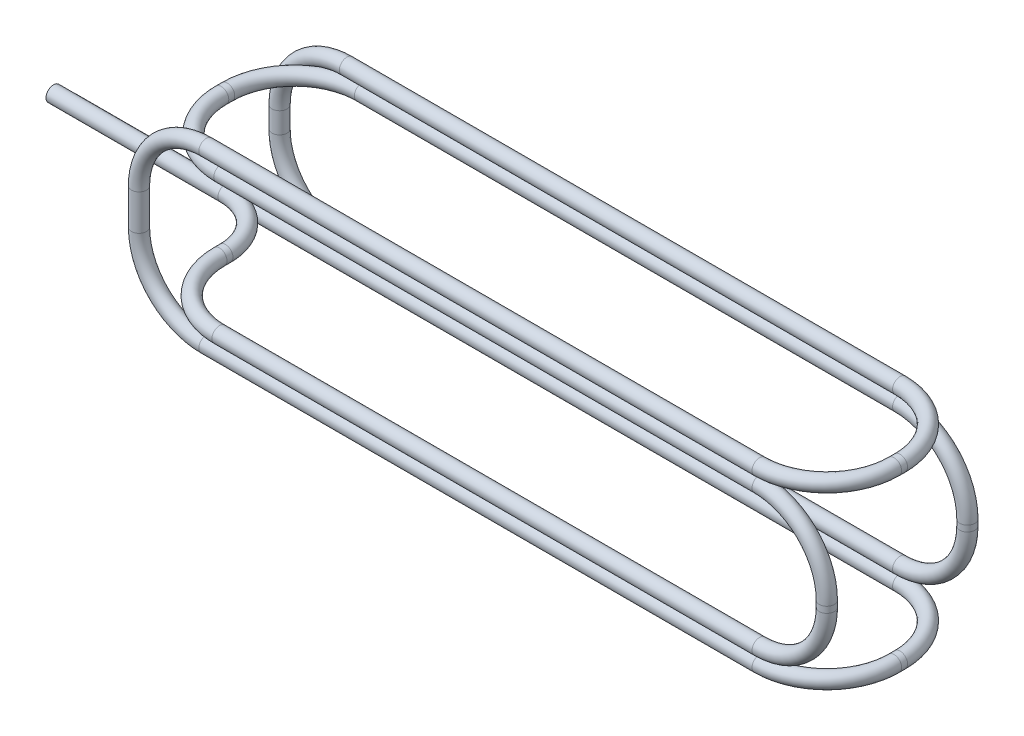
ISO-10303-21;
HEADER;
FILE_DESCRIPTION(('STEP AP214'),'2;1');
FILE_NAME('part.step','',(''),(''),'','','');
FILE_SCHEMA(('AUTOMOTIVE_DESIGN { 1 0 10303 214 1 1 1 1 }'));
ENDSEC;
DATA;
#1=APPLICATION_CONTEXT('core data for automotive mechanical design processes');
#2=APPLICATION_PROTOCOL_DEFINITION('international standard','automotive_design',2000,#1);
#3=PRODUCT_CONTEXT('',#1,'mechanical');
#4=PRODUCT('Part','Part','',(#3));
#5=PRODUCT_RELATED_PRODUCT_CATEGORY('part','',(#4));
#6=PRODUCT_DEFINITION_FORMATION('','',#4);
#7=PRODUCT_DEFINITION_CONTEXT('part definition',#1,'design');
#8=PRODUCT_DEFINITION('design','',#6,#7);
#9=PRODUCT_DEFINITION_SHAPE('','',#8);
#10=(LENGTH_UNIT() NAMED_UNIT(*) SI_UNIT(.MILLI.,.METRE.));
#11=(NAMED_UNIT(*) PLANE_ANGLE_UNIT() SI_UNIT($,.RADIAN.));
#12=(NAMED_UNIT(*) SI_UNIT($,.STERADIAN.) SOLID_ANGLE_UNIT());
#13=UNCERTAINTY_MEASURE_WITH_UNIT(LENGTH_MEASURE(1.E-05),#10,'distance_accuracy_value','');
#14=(GEOMETRIC_REPRESENTATION_CONTEXT(3) GLOBAL_UNCERTAINTY_ASSIGNED_CONTEXT((#13)) GLOBAL_UNIT_ASSIGNED_CONTEXT((#10,
#11,#12)) REPRESENTATION_CONTEXT('',''));
#15=CARTESIAN_POINT('',(0.,0.,0.));
#16=DIRECTION('',(0.,0.,1.));
#17=DIRECTION('',(1.,0.,0.));
#18=AXIS2_PLACEMENT_3D('',#15,#16,#17);
#19=CARTESIAN_POINT('',(-107.489999668157,-3.8842765469954,-45.7181471706571));
#20=DIRECTION('',(-1.,0.,0.));
#21=DIRECTION('',(0.,-1.,0.));
#22=AXIS2_PLACEMENT_3D('',#19,#20,#21);
#23=PLANE('',#22);
#24=CARTESIAN_POINT('',(-107.489999668157,-3.8842765469954,-45.7181471706571));
#25=DIRECTION('',(-1.,0.,0.));
#26=DIRECTION('',(0.,-1.,0.));
#27=AXIS2_PLACEMENT_3D('',#24,#25,#26);
#28=CIRCLE('',#27,2.999775);
#29=CARTESIAN_POINT('',(-107.489999668157,-6.88405154699539,-45.7181471706571));
#30=VERTEX_POINT('',#29);
#31=EDGE_CURVE('E18',#30,#30,#28,.F.);
#32=ORIENTED_EDGE('',*,*,#31,.F.);
#33=EDGE_LOOP('',(#32));
#34=FACE_BOUND('',#33,.T.);
#35=ADVANCED_FACE('F15',(#34),#23,.T.);
#36=CARTESIAN_POINT('',(-38.8464996681565,-3.88427654699539,-45.7181471706571));
#37=DIRECTION('',(-1.,0.,0.));
#38=DIRECTION('',(0.,-1.,0.));
#39=AXIS2_PLACEMENT_3D('',#36,#37,#38);
#40=CYLINDRICAL_SURFACE('',#39,2.999775);
#41=ORIENTED_EDGE('',*,*,#31,.T.);
#42=EDGE_LOOP('',(#41));
#43=FACE_BOUND('',#42,.T.);
#44=CARTESIAN_POINT('',(-38.8464996681566,-3.88427654699539,-45.7181471706571));
#45=DIRECTION('',(1.,0.,0.));
#46=DIRECTION('',(0.,0.,-1.));
#47=AXIS2_PLACEMENT_3D('',#44,#45,#46);
#48=CIRCLE('',#47,2.999775);
#49=CARTESIAN_POINT('',(-38.8464996681566,-3.88427654699539,-48.7179221706571));
#50=VERTEX_POINT('',#49);
#51=EDGE_CURVE('E29',#50,#50,#48,.T.);
#52=ORIENTED_EDGE('',*,*,#51,.F.);
#53=EDGE_LOOP('',(#52));
#54=FACE_BOUND('',#53,.T.);
#55=ADVANCED_FACE('F41',(#43,#54),#40,.T.);
#56=CARTESIAN_POINT('',(-38.8464996681565,-3.88427654699539,-24.8266471706571));
#57=DIRECTION('',(0.,-1.,0.));
#58=DIRECTION('',(1.,0.,0.));
#59=AXIS2_PLACEMENT_3D('',#56,#57,#58);
#60=TOROIDAL_SURFACE('',#59,20.8915,2.999775);
#61=ORIENTED_EDGE('',*,*,#51,.T.);
#62=EDGE_LOOP('',(#61));
#63=FACE_BOUND('',#62,.T.);
#64=CARTESIAN_POINT('',(-17.9549996681565,-3.88427654699538,-24.8266471706572));
#65=DIRECTION('',(0.,0.,1.));
#66=DIRECTION('',(1.,0.,0.));
#67=AXIS2_PLACEMENT_3D('',#64,#65,#66);
#68=CIRCLE('',#67,2.999775);
#69=CARTESIAN_POINT('',(-14.9552246681565,-3.88427654699538,-24.8266471706572));
#70=VERTEX_POINT('',#69);
#71=EDGE_CURVE('E32',#70,#70,#68,.T.);
#72=ORIENTED_EDGE('',*,*,#71,.F.);
#73=EDGE_LOOP('',(#72));
#74=FACE_BOUND('',#73,.T.);
#75=ADVANCED_FACE('F37',(#63,#74),#60,.T.);
#76=CARTESIAN_POINT('',(-17.9549996681565,-3.88427654699538,-24.8266471706572));
#77=DIRECTION('',(0.,0.,1.));
#78=DIRECTION('',(1.,0.,0.));
#79=AXIS2_PLACEMENT_3D('',#76,#77,#78);
#80=CYLINDRICAL_SURFACE('',#79,2.999775);
#81=CARTESIAN_POINT('',(-17.9549996681565,-3.88427654699539,-22.4390471706572));
#82=DIRECTION('',(0.,0.,1.));
#83=DIRECTION('',(-1.,0.,0.));
#84=AXIS2_PLACEMENT_3D('',#81,#82,#83);
#85=CIRCLE('',#84,2.999775);
#86=CARTESIAN_POINT('',(-20.9547746681565,-3.88427654699539,-22.4390471706572));
#87=VERTEX_POINT('',#86);
#88=EDGE_CURVE('E260',#87,#87,#85,.T.);
#89=ORIENTED_EDGE('',*,*,#88,.F.);
#90=EDGE_LOOP('',(#89));
#91=FACE_BOUND('',#90,.T.);
#92=ORIENTED_EDGE('',*,*,#71,.T.);
#93=EDGE_LOOP('',(#92));
#94=FACE_BOUND('',#93,.T.);
#95=ADVANCED_FACE('F40',(#91,#94),#80,.T.);
#96=CARTESIAN_POINT('',(8.90550033184347,-3.88427654699539,-22.4390471706571));
#97=DIRECTION('',(0.,1.,0.));
#98=DIRECTION('',(0.,0.,1.));
#99=AXIS2_PLACEMENT_3D('',#96,#97,#98);
#100=TOROIDAL_SURFACE('',#99,26.8605,2.999775);
#101=CARTESIAN_POINT('',(8.90550033184347,-3.88427654699539,4.42145282934286));
#102=DIRECTION('',(1.,0.,0.));
#103=DIRECTION('',(0.,0.,-1.));
#104=AXIS2_PLACEMENT_3D('',#101,#102,#103);
#105=CIRCLE('',#104,2.999775);
#106=CARTESIAN_POINT('',(8.90550033184347,-3.88427654699539,1.42167782934287));
#107=VERTEX_POINT('',#106);
#108=EDGE_CURVE('E259',#107,#107,#105,.T.);
#109=ORIENTED_EDGE('',*,*,#108,.F.);
#110=EDGE_LOOP('',(#109));
#111=FACE_BOUND('',#110,.T.);
#112=ORIENTED_EDGE('',*,*,#88,.T.);
#113=EDGE_LOOP('',(#112));
#114=FACE_BOUND('',#113,.T.);
#115=ADVANCED_FACE('F253',(#111,#114),#100,.T.);
#116=CARTESIAN_POINT('',(8.90550033184347,-3.88427654699539,4.42145282934286));
#117=DIRECTION('',(1.,0.,0.));
#118=DIRECTION('',(0.,0.,-1.));
#119=AXIS2_PLACEMENT_3D('',#116,#117,#118);
#120=CYLINDRICAL_SURFACE('',#119,2.999775);
#121=CARTESIAN_POINT('',(224.498599261057,-3.88427654699536,4.42145282934286));
#122=DIRECTION('',(1.,0.,0.));
#123=DIRECTION('',(0.,-1.,0.));
#124=AXIS2_PLACEMENT_3D('',#121,#122,#123);
#125=CIRCLE('',#124,2.999775);
#126=CARTESIAN_POINT('',(224.498599261057,-6.88405154699535,4.42145282934286));
#127=VERTEX_POINT('',#126);
#128=EDGE_CURVE('E243',#127,#127,#125,.T.);
#129=ORIENTED_EDGE('',*,*,#128,.F.);
#130=EDGE_LOOP('',(#129));
#131=FACE_BOUND('',#130,.T.);
#132=ORIENTED_EDGE('',*,*,#108,.T.);
#133=EDGE_LOOP('',(#132));
#134=FACE_BOUND('',#133,.T.);
#135=ADVANCED_FACE('F250',(#131,#134),#120,.T.);
#136=CARTESIAN_POINT('',(224.498599261057,22.9762234530046,4.42145282934286));
#137=DIRECTION('',(0.,0.,1.));
#138=DIRECTION('',(1.,0.,0.));
#139=AXIS2_PLACEMENT_3D('',#136,#137,#138);
#140=TOROIDAL_SURFACE('',#139,26.8605,2.999775);
#141=CARTESIAN_POINT('',(251.359099261057,22.9762234530046,4.42145282934286));
#142=DIRECTION('',(0.,1.,0.));
#143=DIRECTION('',(0.,0.,1.));
#144=AXIS2_PLACEMENT_3D('',#141,#142,#143);
#145=CIRCLE('',#144,2.999775);
#146=CARTESIAN_POINT('',(251.359099261057,22.9762234530046,7.42122782934286));
#147=VERTEX_POINT('',#146);
#148=EDGE_CURVE('E240',#147,#147,#145,.T.);
#149=ORIENTED_EDGE('',*,*,#148,.F.);
#150=EDGE_LOOP('',(#149));
#151=FACE_BOUND('',#150,.T.);
#152=ORIENTED_EDGE('',*,*,#128,.T.);
#153=EDGE_LOOP('',(#152));
#154=FACE_BOUND('',#153,.T.);
#155=ADVANCED_FACE('F247',(#151,#154),#140,.T.);
#156=CARTESIAN_POINT('',(251.359099261057,22.9762234530046,4.42145282934286));
#157=DIRECTION('',(0.,1.,0.));
#158=DIRECTION('',(0.,0.,1.));
#159=AXIS2_PLACEMENT_3D('',#156,#157,#158);
#160=CYLINDRICAL_SURFACE('',#159,2.999775);
#161=ORIENTED_EDGE('',*,*,#148,.T.);
#162=EDGE_LOOP('',(#161));
#163=FACE_BOUND('',#162,.T.);
#164=CARTESIAN_POINT('',(251.359099261057,25.4246445564084,4.42145282934286));
#165=DIRECTION('',(0.,1.,0.));
#166=DIRECTION('',(1.,0.,0.));
#167=AXIS2_PLACEMENT_3D('',#164,#165,#166);
#168=CIRCLE('',#167,2.999775);
#169=CARTESIAN_POINT('',(254.358874261057,25.4246445564084,4.42145282934286));
#170=VERTEX_POINT('',#169);
#171=EDGE_CURVE('E237',#170,#170,#168,.T.);
#172=ORIENTED_EDGE('',*,*,#171,.F.);
#173=EDGE_LOOP('',(#172));
#174=FACE_BOUND('',#173,.T.);
#175=ADVANCED_FACE('F231',(#163,#174),#160,.T.);
#176=CARTESIAN_POINT('',(224.498599261057,25.4246445564084,4.42145282934286));
#177=DIRECTION('',(0.,0.,1.));
#178=DIRECTION('',(1.,0.,0.));
#179=AXIS2_PLACEMENT_3D('',#176,#177,#178);
#180=TOROIDAL_SURFACE('',#179,26.8605,2.999775);
#181=CARTESIAN_POINT('',(224.498599261057,52.2851445564084,4.42145282934286));
#182=DIRECTION('',(-1.,0.,0.));
#183=DIRECTION('',(0.,0.,1.));
#184=AXIS2_PLACEMENT_3D('',#181,#182,#183);
#185=CIRCLE('',#184,2.999775);
#186=CARTESIAN_POINT('',(224.498599261057,52.2851445564084,7.42122782934286));
#187=VERTEX_POINT('',#186);
#188=EDGE_CURVE('E236',#187,#187,#185,.T.);
#189=ORIENTED_EDGE('',*,*,#188,.F.);
#190=EDGE_LOOP('',(#189));
#191=FACE_BOUND('',#190,.T.);
#192=ORIENTED_EDGE('',*,*,#171,.T.);
#193=EDGE_LOOP('',(#192));
#194=FACE_BOUND('',#193,.T.);
#195=ADVANCED_FACE('F226',(#191,#194),#180,.T.);
#196=CARTESIAN_POINT('',(224.498599261057,52.2851445564084,4.42145282934286));
#197=DIRECTION('',(-1.,0.,0.));
#198=DIRECTION('',(0.,0.,1.));
#199=AXIS2_PLACEMENT_3D('',#196,#197,#198);
#200=CYLINDRICAL_SURFACE('',#199,2.999775);
#201=ORIENTED_EDGE('',*,*,#188,.T.);
#202=EDGE_LOOP('',(#201));
#203=FACE_BOUND('',#202,.T.);
#204=CARTESIAN_POINT('',(9.61459926105728,52.2851445564084,4.42145282934286));
#205=DIRECTION('',(-1.,0.,0.));
#206=DIRECTION('',(0.,0.,1.));
#207=AXIS2_PLACEMENT_3D('',#204,#205,#206);
#208=CIRCLE('',#207,2.999775);
#209=CARTESIAN_POINT('',(9.61459926105728,52.2851445564084,7.42122782934286));
#210=VERTEX_POINT('',#209);
#211=EDGE_CURVE('E215',#210,#210,#208,.T.);
#212=ORIENTED_EDGE('',*,*,#211,.F.);
#213=EDGE_LOOP('',(#212));
#214=FACE_BOUND('',#213,.T.);
#215=ADVANCED_FACE('F222',(#203,#214),#200,.T.);
#216=CARTESIAN_POINT('',(9.61459926105725,52.2851445564084,-22.4390471706571));
#217=DIRECTION('',(0.,-1.,0.));
#218=DIRECTION('',(0.,0.,-1.));
#219=AXIS2_PLACEMENT_3D('',#216,#217,#218);
#220=TOROIDAL_SURFACE('',#219,26.8605,2.999775);
#221=CARTESIAN_POINT('',(-17.2459007389427,52.2851445564084,-22.4390471706571));
#222=DIRECTION('',(0.,0.,-1.));
#223=DIRECTION('',(-1.,0.,0.));
#224=AXIS2_PLACEMENT_3D('',#221,#222,#223);
#225=CIRCLE('',#224,2.999775);
#226=CARTESIAN_POINT('',(-20.2456757389427,52.2851445564084,-22.4390471706571));
#227=VERTEX_POINT('',#226);
#228=EDGE_CURVE('E212',#227,#227,#225,.T.);
#229=ORIENTED_EDGE('',*,*,#228,.F.);
#230=EDGE_LOOP('',(#229));
#231=FACE_BOUND('',#230,.T.);
#232=ORIENTED_EDGE('',*,*,#211,.T.);
#233=EDGE_LOOP('',(#232));
#234=FACE_BOUND('',#233,.T.);
#235=ADVANCED_FACE('F219',(#231,#234),#220,.T.);
#236=CARTESIAN_POINT('',(-17.2459007389427,52.2851445564084,-22.4390471706571));
#237=DIRECTION('',(0.,0.,-1.));
#238=DIRECTION('',(-1.,0.,0.));
#239=AXIS2_PLACEMENT_3D('',#236,#237,#238);
#240=CYLINDRICAL_SURFACE('',#239,2.999775);
#241=ORIENTED_EDGE('',*,*,#228,.T.);
#242=EDGE_LOOP('',(#241));
#243=FACE_BOUND('',#242,.T.);
#244=CARTESIAN_POINT('',(-17.2459007389427,52.2851445564084,-24.8266471706571));
#245=DIRECTION('',(0.,0.,-1.));
#246=DIRECTION('',(-1.,0.,0.));
#247=AXIS2_PLACEMENT_3D('',#244,#245,#246);
#248=CIRCLE('',#247,2.999775);
#249=CARTESIAN_POINT('',(-20.2456757389427,52.2851445564084,-24.8266471706571));
#250=VERTEX_POINT('',#249);
#251=EDGE_CURVE('E209',#250,#250,#248,.T.);
#252=ORIENTED_EDGE('',*,*,#251,.F.);
#253=EDGE_LOOP('',(#252));
#254=FACE_BOUND('',#253,.T.);
#255=ADVANCED_FACE('F203',(#243,#254),#240,.T.);
#256=CARTESIAN_POINT('',(9.61459926105725,52.2851445564084,-24.8266471706571));
#257=DIRECTION('',(0.,-1.,0.));
#258=DIRECTION('',(0.,0.,-1.));
#259=AXIS2_PLACEMENT_3D('',#256,#257,#258);
#260=TOROIDAL_SURFACE('',#259,26.8605,2.999775);
#261=CARTESIAN_POINT('',(9.61459926105726,52.2851445564084,-51.6871471706571));
#262=DIRECTION('',(1.,0.,0.));
#263=DIRECTION('',(0.,0.,-1.));
#264=AXIS2_PLACEMENT_3D('',#261,#262,#263);
#265=CIRCLE('',#264,2.999775);
#266=CARTESIAN_POINT('',(9.61459926105726,52.2851445564084,-54.6869221706571));
#267=VERTEX_POINT('',#266);
#268=EDGE_CURVE('E208',#267,#267,#265,.T.);
#269=ORIENTED_EDGE('',*,*,#268,.F.);
#270=EDGE_LOOP('',(#269));
#271=FACE_BOUND('',#270,.T.);
#272=ORIENTED_EDGE('',*,*,#251,.T.);
#273=EDGE_LOOP('',(#272));
#274=FACE_BOUND('',#273,.T.);
#275=ADVANCED_FACE('F198',(#271,#274),#260,.T.);
#276=CARTESIAN_POINT('',(9.61459926105727,52.2851445564084,-51.6871471706571));
#277=DIRECTION('',(1.,0.,0.));
#278=DIRECTION('',(0.,0.,-1.));
#279=AXIS2_PLACEMENT_3D('',#276,#277,#278);
#280=CYLINDRICAL_SURFACE('',#279,2.999775);
#281=ORIENTED_EDGE('',*,*,#268,.T.);
#282=EDGE_LOOP('',(#281));
#283=FACE_BOUND('',#282,.T.);
#284=CARTESIAN_POINT('',(224.498599261057,52.2851445564084,-51.6871471706571));
#285=DIRECTION('',(1.,0.,0.));
#286=DIRECTION('',(0.,1.,0.));
#287=AXIS2_PLACEMENT_3D('',#284,#285,#286);
#288=CIRCLE('',#287,2.999775);
#289=CARTESIAN_POINT('',(224.498599261057,55.2849195564084,-51.6871471706571));
#290=VERTEX_POINT('',#289);
#291=EDGE_CURVE('E187',#290,#290,#288,.T.);
#292=ORIENTED_EDGE('',*,*,#291,.F.);
#293=EDGE_LOOP('',(#292));
#294=FACE_BOUND('',#293,.T.);
#295=ADVANCED_FACE('F194',(#283,#294),#280,.T.);
#296=CARTESIAN_POINT('',(224.498599261057,25.4246445564084,-51.6871471706571));
#297=DIRECTION('',(0.,0.,-1.));
#298=DIRECTION('',(-1.,0.,0.));
#299=AXIS2_PLACEMENT_3D('',#296,#297,#298);
#300=TOROIDAL_SURFACE('',#299,26.8605,2.999775);
#301=CARTESIAN_POINT('',(251.359099261057,25.4246445564083,-51.6871471706571));
#302=DIRECTION('',(0.,-1.,0.));
#303=DIRECTION('',(0.,0.,-1.));
#304=AXIS2_PLACEMENT_3D('',#301,#302,#303);
#305=CIRCLE('',#304,2.999775);
#306=CARTESIAN_POINT('',(251.359099261057,25.4246445564083,-54.6869221706571));
#307=VERTEX_POINT('',#306);
#308=EDGE_CURVE('E184',#307,#307,#305,.T.);
#309=ORIENTED_EDGE('',*,*,#308,.F.);
#310=EDGE_LOOP('',(#309));
#311=FACE_BOUND('',#310,.T.);
#312=ORIENTED_EDGE('',*,*,#291,.T.);
#313=EDGE_LOOP('',(#312));
#314=FACE_BOUND('',#313,.T.);
#315=ADVANCED_FACE('F191',(#311,#314),#300,.T.);
#316=CARTESIAN_POINT('',(251.359099261057,25.4246445564083,-51.6871471706571));
#317=DIRECTION('',(0.,-1.,0.));
#318=DIRECTION('',(0.,0.,-1.));
#319=AXIS2_PLACEMENT_3D('',#316,#317,#318);
#320=CYLINDRICAL_SURFACE('',#319,2.999775);
#321=ORIENTED_EDGE('',*,*,#308,.T.);
#322=EDGE_LOOP('',(#321));
#323=FACE_BOUND('',#322,.T.);
#324=CARTESIAN_POINT('',(251.359099261057,23.0370445564083,-51.6871471706571));
#325=DIRECTION('',(0.,-1.,0.));
#326=DIRECTION('',(1.,0.,0.));
#327=AXIS2_PLACEMENT_3D('',#324,#325,#326);
#328=CIRCLE('',#327,2.999775);
#329=CARTESIAN_POINT('',(254.358874261057,23.0370445564083,-51.6871471706571));
#330=VERTEX_POINT('',#329);
#331=EDGE_CURVE('E181',#330,#330,#328,.T.);
#332=ORIENTED_EDGE('',*,*,#331,.F.);
#333=EDGE_LOOP('',(#332));
#334=FACE_BOUND('',#333,.T.);
#335=ADVANCED_FACE('F175',(#323,#334),#320,.T.);
#336=CARTESIAN_POINT('',(224.498599261057,23.0370445564084,-51.6871471706571));
#337=DIRECTION('',(0.,0.,-1.));
#338=DIRECTION('',(0.,1.,0.));
#339=AXIS2_PLACEMENT_3D('',#336,#337,#338);
#340=TOROIDAL_SURFACE('',#339,26.8605,2.999775);
#341=CARTESIAN_POINT('',(224.498599261057,-3.82345544359162,-51.6871471706571));
#342=DIRECTION('',(-1.,0.,0.));
#343=DIRECTION('',(0.,-1.,0.));
#344=AXIS2_PLACEMENT_3D('',#341,#342,#343);
#345=CIRCLE('',#344,2.999775);
#346=CARTESIAN_POINT('',(224.498599261057,-6.82323044359162,-51.6871471706571));
#347=VERTEX_POINT('',#346);
#348=EDGE_CURVE('E180',#347,#347,#345,.T.);
#349=ORIENTED_EDGE('',*,*,#348,.F.);
#350=EDGE_LOOP('',(#349));
#351=FACE_BOUND('',#350,.T.);
#352=ORIENTED_EDGE('',*,*,#331,.T.);
#353=EDGE_LOOP('',(#352));
#354=FACE_BOUND('',#353,.T.);
#355=ADVANCED_FACE('F170',(#351,#354),#340,.T.);
#356=CARTESIAN_POINT('',(224.498599261057,-3.82345544359162,-51.6871471706571));
#357=DIRECTION('',(-1.,0.,0.));
#358=DIRECTION('',(0.,-1.,0.));
#359=AXIS2_PLACEMENT_3D('',#356,#357,#358);
#360=CYLINDRICAL_SURFACE('',#359,2.999775);
#361=ORIENTED_EDGE('',*,*,#348,.T.);
#362=EDGE_LOOP('',(#361));
#363=FACE_BOUND('',#362,.T.);
#364=CARTESIAN_POINT('',(3.64559926105728,-3.82345544359163,-51.6871471706571));
#365=DIRECTION('',(-1.,0.,0.));
#366=DIRECTION('',(0.,-1.,0.));
#367=AXIS2_PLACEMENT_3D('',#364,#365,#366);
#368=CIRCLE('',#367,2.999775);
#369=CARTESIAN_POINT('',(3.64559926105728,-6.82323044359162,-51.6871471706571));
#370=VERTEX_POINT('',#369);
#371=EDGE_CURVE('E159',#370,#370,#368,.T.);
#372=ORIENTED_EDGE('',*,*,#371,.F.);
#373=EDGE_LOOP('',(#372));
#374=FACE_BOUND('',#373,.T.);
#375=ADVANCED_FACE('F166',(#363,#374),#360,.T.);
#376=CARTESIAN_POINT('',(3.64559926105728,23.0370445564084,-51.6871471706571));
#377=DIRECTION('',(0.,0.,-1.));
#378=DIRECTION('',(-1.,0.,0.));
#379=AXIS2_PLACEMENT_3D('',#376,#377,#378);
#380=TOROIDAL_SURFACE('',#379,26.8605,2.999775);
#381=CARTESIAN_POINT('',(-23.2149007389427,23.0370445564084,-51.6871471706571));
#382=DIRECTION('',(0.,1.,0.));
#383=DIRECTION('',(-1.,0.,0.));
#384=AXIS2_PLACEMENT_3D('',#381,#382,#383);
#385=CIRCLE('',#384,2.999775);
#386=CARTESIAN_POINT('',(-26.2146757389427,23.0370445564084,-51.6871471706571));
#387=VERTEX_POINT('',#386);
#388=EDGE_CURVE('E156',#387,#387,#385,.T.);
#389=ORIENTED_EDGE('',*,*,#388,.F.);
#390=EDGE_LOOP('',(#389));
#391=FACE_BOUND('',#390,.T.);
#392=ORIENTED_EDGE('',*,*,#371,.T.);
#393=EDGE_LOOP('',(#392));
#394=FACE_BOUND('',#393,.T.);
#395=ADVANCED_FACE('F163',(#391,#394),#380,.T.);
#396=CARTESIAN_POINT('',(-23.2149007389427,23.0370445564084,-51.6871471706571));
#397=DIRECTION('',(0.,1.,0.));
#398=DIRECTION('',(-1.,0.,0.));
#399=AXIS2_PLACEMENT_3D('',#396,#397,#398);
#400=CYLINDRICAL_SURFACE('',#399,2.999775);
#401=ORIENTED_EDGE('',*,*,#388,.T.);
#402=EDGE_LOOP('',(#401));
#403=FACE_BOUND('',#402,.T.);
#404=CARTESIAN_POINT('',(-23.2149007389427,31.3936445564083,-51.6871471706571));
#405=DIRECTION('',(0.,1.,0.));
#406=DIRECTION('',(-1.,0.,0.));
#407=AXIS2_PLACEMENT_3D('',#404,#405,#406);
#408=CIRCLE('',#407,2.999775);
#409=CARTESIAN_POINT('',(-26.2146757389427,31.3936445564083,-51.6871471706571));
#410=VERTEX_POINT('',#409);
#411=EDGE_CURVE('E153',#410,#410,#408,.T.);
#412=ORIENTED_EDGE('',*,*,#411,.F.);
#413=EDGE_LOOP('',(#412));
#414=FACE_BOUND('',#413,.T.);
#415=ADVANCED_FACE('F147',(#403,#414),#400,.T.);
#416=CARTESIAN_POINT('',(3.64559926105728,31.3936445564084,-51.6871471706571));
#417=DIRECTION('',(0.,0.,-1.));
#418=DIRECTION('',(0.,1.,0.));
#419=AXIS2_PLACEMENT_3D('',#416,#417,#418);
#420=TOROIDAL_SURFACE('',#419,26.8605,2.999775);
#421=CARTESIAN_POINT('',(3.64559926105727,58.2541445564084,-51.6871471706571));
#422=DIRECTION('',(1.,0.,0.));
#423=DIRECTION('',(0.,0.,-1.));
#424=AXIS2_PLACEMENT_3D('',#421,#422,#423);
#425=CIRCLE('',#424,2.999775);
#426=CARTESIAN_POINT('',(3.64559926105727,58.2541445564084,-54.6869221706571));
#427=VERTEX_POINT('',#426);
#428=EDGE_CURVE('E152',#427,#427,#425,.T.);
#429=ORIENTED_EDGE('',*,*,#428,.F.);
#430=EDGE_LOOP('',(#429));
#431=FACE_BOUND('',#430,.T.);
#432=ORIENTED_EDGE('',*,*,#411,.T.);
#433=EDGE_LOOP('',(#432));
#434=FACE_BOUND('',#433,.T.);
#435=ADVANCED_FACE('F142',(#431,#434),#420,.T.);
#436=CARTESIAN_POINT('',(3.64559926105728,58.2541445564084,-51.6871471706571));
#437=DIRECTION('',(1.,0.,0.));
#438=DIRECTION('',(0.,0.,-1.));
#439=AXIS2_PLACEMENT_3D('',#436,#437,#438);
#440=CYLINDRICAL_SURFACE('',#439,2.999775);
#441=ORIENTED_EDGE('',*,*,#428,.T.);
#442=EDGE_LOOP('',(#441));
#443=FACE_BOUND('',#442,.T.);
#444=CARTESIAN_POINT('',(224.498599261057,58.2541445564084,-51.6871471706572));
#445=DIRECTION('',(1.,0.,0.));
#446=DIRECTION('',(0.,0.,-1.));
#447=AXIS2_PLACEMENT_3D('',#444,#445,#446);
#448=CIRCLE('',#447,2.999775);
#449=CARTESIAN_POINT('',(224.498599261057,58.2541445564084,-54.6869221706572));
#450=VERTEX_POINT('',#449);
#451=EDGE_CURVE('E131',#450,#450,#448,.T.);
#452=ORIENTED_EDGE('',*,*,#451,.F.);
#453=EDGE_LOOP('',(#452));
#454=FACE_BOUND('',#453,.T.);
#455=ADVANCED_FACE('F138',(#443,#454),#440,.T.);
#456=CARTESIAN_POINT('',(224.498599261057,58.2541445564084,-24.8266471706572));
#457=DIRECTION('',(0.,-1.,0.));
#458=DIRECTION('',(0.,0.,-1.));
#459=AXIS2_PLACEMENT_3D('',#456,#457,#458);
#460=TOROIDAL_SURFACE('',#459,26.8605,2.999775);
#461=CARTESIAN_POINT('',(251.359099261057,58.2541445564084,-24.8266471706571));
#462=DIRECTION('',(0.,0.,1.));
#463=DIRECTION('',(1.,0.,0.));
#464=AXIS2_PLACEMENT_3D('',#461,#462,#463);
#465=CIRCLE('',#464,2.99977499999998);
#466=CARTESIAN_POINT('',(254.358874261057,58.2541445564084,-24.8266471706571));
#467=VERTEX_POINT('',#466);
#468=EDGE_CURVE('E128',#467,#467,#465,.T.);
#469=ORIENTED_EDGE('',*,*,#468,.F.);
#470=EDGE_LOOP('',(#469));
#471=FACE_BOUND('',#470,.T.);
#472=ORIENTED_EDGE('',*,*,#451,.T.);
#473=EDGE_LOOP('',(#472));
#474=FACE_BOUND('',#473,.T.);
#475=ADVANCED_FACE('F135',(#471,#474),#460,.T.);
#476=CARTESIAN_POINT('',(251.359099261057,58.2541445564084,-24.8266471706571));
#477=DIRECTION('',(0.,0.,1.));
#478=DIRECTION('',(1.,0.,0.));
#479=AXIS2_PLACEMENT_3D('',#476,#477,#478);
#480=CYLINDRICAL_SURFACE('',#479,2.99977499999998);
#481=ORIENTED_EDGE('',*,*,#468,.T.);
#482=EDGE_LOOP('',(#481));
#483=FACE_BOUND('',#482,.T.);
#484=CARTESIAN_POINT('',(251.359099261057,58.2541445564084,-22.4390471706571));
#485=DIRECTION('',(0.,0.,1.));
#486=DIRECTION('',(1.,0.,0.));
#487=AXIS2_PLACEMENT_3D('',#484,#485,#486);
#488=CIRCLE('',#487,2.999775);
#489=CARTESIAN_POINT('',(254.358874261057,58.2541445564084,-22.4390471706571));
#490=VERTEX_POINT('',#489);
#491=EDGE_CURVE('E125',#490,#490,#488,.T.);
#492=ORIENTED_EDGE('',*,*,#491,.F.);
#493=EDGE_LOOP('',(#492));
#494=FACE_BOUND('',#493,.T.);
#495=ADVANCED_FACE('F118',(#483,#494),#480,.T.);
#496=CARTESIAN_POINT('',(224.498599261057,58.2541445564084,-22.4390471706571));
#497=DIRECTION('',(0.,-1.,0.));
#498=DIRECTION('',(0.,0.,-1.));
#499=AXIS2_PLACEMENT_3D('',#496,#497,#498);
#500=TOROIDAL_SURFACE('',#499,26.8605,2.999775);
#501=CARTESIAN_POINT('',(224.498599261057,58.2541445564084,4.4214528293428));
#502=DIRECTION('',(-1.,0.,0.));
#503=DIRECTION('',(0.,0.,1.));
#504=AXIS2_PLACEMENT_3D('',#501,#502,#503);
#505=CIRCLE('',#504,2.999775);
#506=CARTESIAN_POINT('',(224.498599261057,58.2541445564084,7.42122782934279));
#507=VERTEX_POINT('',#506);
#508=EDGE_CURVE('E124',#507,#507,#505,.T.);
#509=ORIENTED_EDGE('',*,*,#508,.F.);
#510=EDGE_LOOP('',(#509));
#511=FACE_BOUND('',#510,.T.);
#512=ORIENTED_EDGE('',*,*,#491,.T.);
#513=EDGE_LOOP('',(#512));
#514=FACE_BOUND('',#513,.T.);
#515=ADVANCED_FACE('F113',(#511,#514),#500,.T.);
#516=CARTESIAN_POINT('',(224.498599261057,58.2541445564084,4.4214528293428));
#517=DIRECTION('',(-1.,0.,0.));
#518=DIRECTION('',(0.,0.,1.));
#519=AXIS2_PLACEMENT_3D('',#516,#517,#518);
#520=CYLINDRICAL_SURFACE('',#519,2.999775);
#521=ORIENTED_EDGE('',*,*,#508,.T.);
#522=EDGE_LOOP('',(#521));
#523=FACE_BOUND('',#522,.T.);
#524=CARTESIAN_POINT('',(3.64559926105724,58.2541445564084,4.42145282934281));
#525=DIRECTION('',(-1.,0.,0.));
#526=DIRECTION('',(0.,1.,0.));
#527=AXIS2_PLACEMENT_3D('',#524,#525,#526);
#528=CIRCLE('',#527,2.999775);
#529=CARTESIAN_POINT('',(3.64559926105724,61.2539195564084,4.42145282934281));
#530=VERTEX_POINT('',#529);
#531=EDGE_CURVE('E515',#530,#530,#528,.T.);
#532=ORIENTED_EDGE('',*,*,#531,.F.);
#533=EDGE_LOOP('',(#532));
#534=FACE_BOUND('',#533,.T.);
#535=ADVANCED_FACE('F109',(#523,#534),#520,.T.);
#536=CARTESIAN_POINT('',(3.64559926105728,31.3936445564084,4.42145282934281));
#537=DIRECTION('',(0.,0.,1.));
#538=DIRECTION('',(1.,0.,0.));
#539=AXIS2_PLACEMENT_3D('',#536,#537,#538);
#540=TOROIDAL_SURFACE('',#539,26.8605,2.999775);
#541=ORIENTED_EDGE('',*,*,#531,.T.);
#542=EDGE_LOOP('',(#541));
#543=FACE_BOUND('',#542,.T.);
#544=CARTESIAN_POINT('',(-23.2149007389427,31.3936445564083,4.42145282934281));
#545=DIRECTION('',(0.,-1.,0.));
#546=DIRECTION('',(0.,0.,-1.));
#547=AXIS2_PLACEMENT_3D('',#544,#545,#546);
#548=CIRCLE('',#547,2.999775);
#549=CARTESIAN_POINT('',(-23.2149007389427,31.3936445564083,1.42167782934282));
#550=VERTEX_POINT('',#549);
#551=EDGE_CURVE('E102',#550,#550,#548,.T.);
#552=ORIENTED_EDGE('',*,*,#551,.F.);
#553=EDGE_LOOP('',(#552));
#554=FACE_BOUND('',#553,.T.);
#555=ADVANCED_FACE('F106',(#543,#554),#540,.T.);
#556=CARTESIAN_POINT('',(-23.2149007389427,31.3936445564083,4.42145282934281));
#557=DIRECTION('',(0.,-1.,0.));
#558=DIRECTION('',(0.,0.,-1.));
#559=AXIS2_PLACEMENT_3D('',#556,#557,#558);
#560=CYLINDRICAL_SURFACE('',#559,2.999775);
#561=CARTESIAN_POINT('',(-23.2149007389427,17.0680445564084,4.42145282934282));
#562=DIRECTION('',(0.,-1.,0.));
#563=DIRECTION('',(-1.,0.,0.));
#564=AXIS2_PLACEMENT_3D('',#561,#562,#563);
#565=CIRCLE('',#564,2.999775);
#566=CARTESIAN_POINT('',(-26.2146757389427,17.0680445564084,4.42145282934282));
#567=VERTEX_POINT('',#566);
#568=EDGE_CURVE('E99',#567,#567,#565,.T.);
#569=ORIENTED_EDGE('',*,*,#568,.F.);
#570=EDGE_LOOP('',(#569));
#571=FACE_BOUND('',#570,.T.);
#572=ORIENTED_EDGE('',*,*,#551,.T.);
#573=EDGE_LOOP('',(#572));
#574=FACE_BOUND('',#573,.T.);
#575=ADVANCED_FACE('F93',(#571,#574),#560,.T.);
#576=CARTESIAN_POINT('',(3.64559926105728,17.0680445564084,4.42145282934282));
#577=DIRECTION('',(0.,0.,1.));
#578=DIRECTION('',(1.,0.,0.));
#579=AXIS2_PLACEMENT_3D('',#576,#577,#578);
#580=TOROIDAL_SURFACE('',#579,26.8605,2.999775);
#581=ORIENTED_EDGE('',*,*,#568,.T.);
#582=EDGE_LOOP('',(#581));
#583=FACE_BOUND('',#582,.T.);
#584=CARTESIAN_POINT('',(3.64559926105732,-9.79245544359163,4.42145282934282));
#585=DIRECTION('',(1.,0.,0.));
#586=DIRECTION('',(0.,1.,0.));
#587=AXIS2_PLACEMENT_3D('',#584,#585,#586);
#588=CIRCLE('',#587,2.999775);
#589=CARTESIAN_POINT('',(3.64559926105732,-6.79268044359163,4.42145282934282));
#590=VERTEX_POINT('',#589);
#591=EDGE_CURVE('E98',#590,#590,#588,.T.);
#592=ORIENTED_EDGE('',*,*,#591,.F.);
#593=EDGE_LOOP('',(#592));
#594=FACE_BOUND('',#593,.T.);
#595=ADVANCED_FACE('F88',(#583,#594),#580,.T.);
#596=CARTESIAN_POINT('',(3.64559926105732,-9.79245544359163,4.42145282934282));
#597=DIRECTION('',(1.,0.,0.));
#598=DIRECTION('',(0.,1.,0.));
#599=AXIS2_PLACEMENT_3D('',#596,#597,#598);
#600=CYLINDRICAL_SURFACE('',#599,2.999775);
#601=ORIENTED_EDGE('',*,*,#591,.T.);
#602=EDGE_LOOP('',(#601));
#603=FACE_BOUND('',#602,.T.);
#604=CARTESIAN_POINT('',(224.498599261057,-9.79245544359162,4.42145282934282));
#605=DIRECTION('',(1.,0.,0.));
#606=DIRECTION('',(0.,0.,1.));
#607=AXIS2_PLACEMENT_3D('',#604,#605,#606);
#608=CIRCLE('',#607,2.999775);
#609=CARTESIAN_POINT('',(224.498599261057,-9.79245544359162,7.42122782934281));
#610=VERTEX_POINT('',#609);
#611=EDGE_CURVE('E75',#610,#610,#608,.T.);
#612=ORIENTED_EDGE('',*,*,#611,.F.);
#613=EDGE_LOOP('',(#612));
#614=FACE_BOUND('',#613,.T.);
#615=ADVANCED_FACE('F84',(#603,#614),#600,.T.);
#616=CARTESIAN_POINT('',(224.498599261057,-9.79245544359162,-22.4390471706571));
#617=DIRECTION('',(0.,1.,0.));
#618=DIRECTION('',(0.,0.,1.));
#619=AXIS2_PLACEMENT_3D('',#616,#617,#618);
#620=TOROIDAL_SURFACE('',#619,26.8605,2.999775);
#621=ORIENTED_EDGE('',*,*,#611,.T.);
#622=EDGE_LOOP('',(#621));
#623=FACE_BOUND('',#622,.T.);
#624=CARTESIAN_POINT('',(251.359099261057,-9.79245544359162,-22.4390471706572));
#625=DIRECTION('',(0.,0.,-1.));
#626=DIRECTION('',(-1.,0.,0.));
#627=AXIS2_PLACEMENT_3D('',#624,#625,#626);
#628=CIRCLE('',#627,2.99977499999998);
#629=CARTESIAN_POINT('',(248.359324261057,-9.79245544359162,-22.4390471706572));
#630=VERTEX_POINT('',#629);
#631=EDGE_CURVE('E72',#630,#630,#628,.T.);
#632=ORIENTED_EDGE('',*,*,#631,.F.);
#633=EDGE_LOOP('',(#632));
#634=FACE_BOUND('',#633,.T.);
#635=ADVANCED_FACE('F80',(#623,#634),#620,.T.);
#636=CARTESIAN_POINT('',(251.359099261057,-9.79245544359162,-22.4390471706572));
#637=DIRECTION('',(0.,0.,-1.));
#638=DIRECTION('',(-1.,0.,0.));
#639=AXIS2_PLACEMENT_3D('',#636,#637,#638);
#640=CYLINDRICAL_SURFACE('',#639,2.99977499999998);
#641=ORIENTED_EDGE('',*,*,#631,.T.);
#642=EDGE_LOOP('',(#641));
#643=FACE_BOUND('',#642,.T.);
#644=CARTESIAN_POINT('',(251.359099261057,-9.79245544359162,-24.8266471706572));
#645=DIRECTION('',(0.,0.,-1.));
#646=DIRECTION('',(1.,0.,0.));
#647=AXIS2_PLACEMENT_3D('',#644,#645,#646);
#648=CIRCLE('',#647,2.999775);
#649=CARTESIAN_POINT('',(254.358874261057,-9.79245544359162,-24.8266471706572));
#650=VERTEX_POINT('',#649);
#651=EDGE_CURVE('E26',#650,#650,#648,.T.);
#652=ORIENTED_EDGE('',*,*,#651,.F.);
#653=EDGE_LOOP('',(#652));
#654=FACE_BOUND('',#653,.T.);
#655=ADVANCED_FACE('F83',(#643,#654),#640,.T.);
#656=CARTESIAN_POINT('',(-106.780900738943,-9.79245544359165,-51.687147170657));
#657=DIRECTION('',(1.,0.,0.));
#658=DIRECTION('',(0.,1.,0.));
#659=AXIS2_PLACEMENT_3D('',#656,#657,#658);
#660=PLANE('',#659);
#661=CARTESIAN_POINT('',(-106.780900738943,-9.79245544359165,-51.6871471706571));
#662=DIRECTION('',(-1.,0.,0.));
#663=DIRECTION('',(0.,-1.,0.));
#664=AXIS2_PLACEMENT_3D('',#661,#662,#663);
#665=CIRCLE('',#664,2.999775);
#666=CARTESIAN_POINT('',(-106.780900738943,-12.7922304435916,-51.6871471706571));
#667=VERTEX_POINT('',#666);
#668=EDGE_CURVE('E10',#667,#667,#665,.F.);
#669=ORIENTED_EDGE('',*,*,#668,.F.);
#670=EDGE_LOOP('',(#669));
#671=FACE_BOUND('',#670,.T.);
#672=ADVANCED_FACE('F61',(#671),#660,.F.);
#673=CARTESIAN_POINT('',(224.498599261057,-9.79245544359162,-24.8266471706571));
#674=DIRECTION('',(0.,1.,0.));
#675=DIRECTION('',(0.,0.,1.));
#676=AXIS2_PLACEMENT_3D('',#673,#674,#675);
#677=TOROIDAL_SURFACE('',#676,26.8604999999999,2.999775);
#678=ORIENTED_EDGE('',*,*,#651,.T.);
#679=EDGE_LOOP('',(#678));
#680=FACE_BOUND('',#679,.T.);
#681=CARTESIAN_POINT('',(224.498599261057,-9.79245544359162,-51.6871471706571));
#682=DIRECTION('',(-1.,0.,0.));
#683=DIRECTION('',(0.,-1.,0.));
#684=AXIS2_PLACEMENT_3D('',#681,#682,#683);
#685=CIRCLE('',#684,2.999775);
#686=CARTESIAN_POINT('',(224.498599261057,-12.7922304435916,-51.6871471706571));
#687=VERTEX_POINT('',#686);
#688=EDGE_CURVE('E22',#687,#687,#685,.T.);
#689=ORIENTED_EDGE('',*,*,#688,.F.);
#690=EDGE_LOOP('',(#689));
#691=FACE_BOUND('',#690,.T.);
#692=ADVANCED_FACE('F56',(#680,#691),#677,.T.);
#693=CARTESIAN_POINT('',(224.498599261057,-9.79245544359162,-51.6871471706571));
#694=DIRECTION('',(-1.,0.,0.));
#695=DIRECTION('',(0.,-1.,0.));
#696=AXIS2_PLACEMENT_3D('',#693,#694,#695);
#697=CYLINDRICAL_SURFACE('',#696,2.999775);
#698=ORIENTED_EDGE('',*,*,#668,.T.);
#699=EDGE_LOOP('',(#698));
#700=FACE_BOUND('',#699,.T.);
#701=ORIENTED_EDGE('',*,*,#688,.T.);
#702=EDGE_LOOP('',(#701));
#703=FACE_BOUND('',#702,.T.);
#704=ADVANCED_FACE('F54',(#700,#703),#697,.T.);
#705=CLOSED_SHELL('',(#35,#55,#75,#95,#115,#135,#155,#175,#195,#215,#235,#255,#275,#295,#315,
#335,#355,#375,#395,#415,#435,#455,#475,#495,#515,#535,#555,#575,#595,#615,#635,#655,#672,#692,#704));
#706=MANIFOLD_SOLID_BREP('B1',#705);
#707=ADVANCED_BREP_SHAPE_REPRESENTATION('',(#18,#706),#14);
#708=SHAPE_DEFINITION_REPRESENTATION(#9,#707);
ENDSEC;
END-ISO-10303-21;
